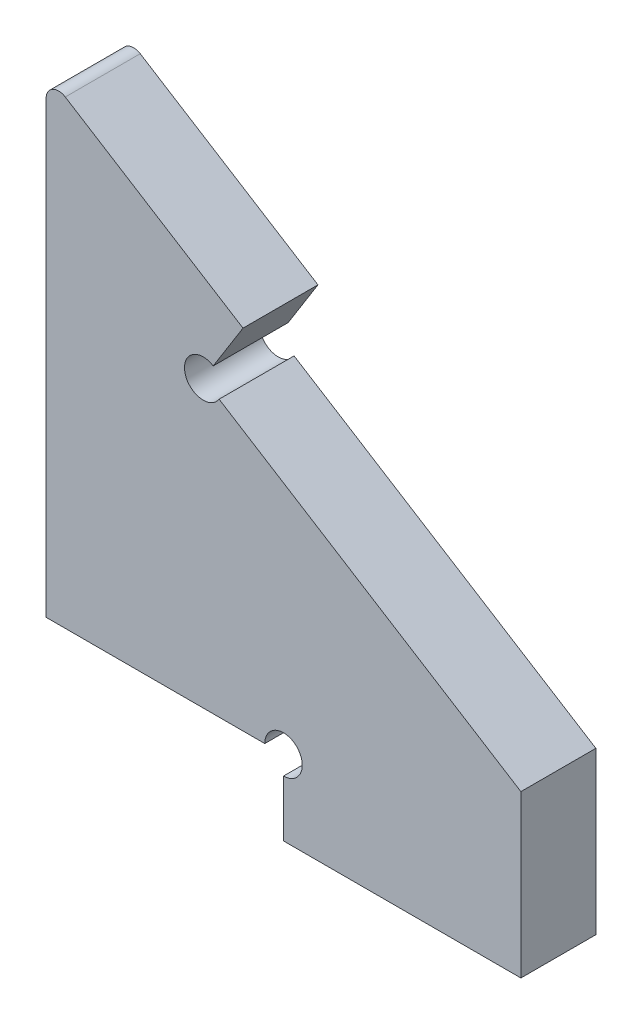
ISO-10303-21;
HEADER;
FILE_DESCRIPTION(('STEP AP214'),'2;1');
FILE_NAME('part.step','',(''),(''),'','','');
FILE_SCHEMA(('AUTOMOTIVE_DESIGN { 1 0 10303 214 1 1 1 1 }'));
ENDSEC;
DATA;
#1=APPLICATION_CONTEXT('core data for automotive mechanical design processes');
#2=APPLICATION_PROTOCOL_DEFINITION('international standard','automotive_design',2000,#1);
#3=PRODUCT_CONTEXT('',#1,'mechanical');
#4=PRODUCT('Part','Part','',(#3));
#5=PRODUCT_RELATED_PRODUCT_CATEGORY('part','',(#4));
#6=PRODUCT_DEFINITION_FORMATION('','',#4);
#7=PRODUCT_DEFINITION_CONTEXT('part definition',#1,'design');
#8=PRODUCT_DEFINITION('design','',#6,#7);
#9=PRODUCT_DEFINITION_SHAPE('','',#8);
#10=(LENGTH_UNIT() NAMED_UNIT(*) SI_UNIT(.MILLI.,.METRE.));
#11=(NAMED_UNIT(*) PLANE_ANGLE_UNIT() SI_UNIT($,.RADIAN.));
#12=(NAMED_UNIT(*) SI_UNIT($,.STERADIAN.) SOLID_ANGLE_UNIT());
#13=UNCERTAINTY_MEASURE_WITH_UNIT(LENGTH_MEASURE(1.E-05),#10,'distance_accuracy_value','');
#14=(GEOMETRIC_REPRESENTATION_CONTEXT(3) GLOBAL_UNCERTAINTY_ASSIGNED_CONTEXT((#13)) GLOBAL_UNIT_ASSIGNED_CONTEXT((#10,
#11,#12)) REPRESENTATION_CONTEXT('',''));
#15=CARTESIAN_POINT('',(0.,0.,0.));
#16=DIRECTION('',(0.,0.,1.));
#17=DIRECTION('',(1.,0.,0.));
#18=AXIS2_PLACEMENT_3D('',#15,#16,#17);
#19=CARTESIAN_POINT('',(724.,125.,-24.9999999999996));
#20=DIRECTION('',(0.,1.,0.));
#21=DIRECTION('',(0.,0.,1.));
#22=AXIS2_PLACEMENT_3D('',#19,#20,#21);
#23=PLANE('',#22);
#24=DIRECTION('',(1.,0.,0.));
#25=VECTOR('',#24,1.);
#26=CARTESIAN_POINT('',(724.,125.,-30.9999999999996));
#27=LINE('',#26,#25);
#28=CARTESIAN_POINT('',(705.,125.,-30.9999999999996));
#29=VERTEX_POINT('',#28);
#30=CARTESIAN_POINT('',(724.,125.,-30.9999999999996));
#31=VERTEX_POINT('',#30);
#32=EDGE_CURVE('E160',#29,#31,#27,.T.);
#33=ORIENTED_EDGE('',*,*,#32,.T.);
#34=DIRECTION('',(0.,0.,-1.));
#35=VECTOR('',#34,1.);
#36=CARTESIAN_POINT('',(724.,125.,-24.9999999999996));
#37=LINE('',#36,#35);
#38=CARTESIAN_POINT('',(724.,125.,-24.9999999999996));
#39=VERTEX_POINT('',#38);
#40=EDGE_CURVE('E204',#39,#31,#37,.T.);
#41=ORIENTED_EDGE('',*,*,#40,.F.);
#42=DIRECTION('',(1.,0.,0.));
#43=VECTOR('',#42,1.);
#44=CARTESIAN_POINT('',(724.,125.,-24.9999999999996));
#45=LINE('',#44,#43);
#46=CARTESIAN_POINT('',(705.,125.,-24.9999999999996));
#47=VERTEX_POINT('',#46);
#48=EDGE_CURVE('E181',#47,#39,#45,.T.);
#49=ORIENTED_EDGE('',*,*,#48,.F.);
#50=DIRECTION('',(0.,0.,-1.));
#51=VECTOR('',#50,1.);
#52=CARTESIAN_POINT('',(705.,125.,-24.9999999999996));
#53=LINE('',#52,#51);
#54=EDGE_CURVE('E191',#47,#29,#53,.T.);
#55=ORIENTED_EDGE('',*,*,#54,.T.);
#56=EDGE_LOOP('',(#33,#41,#49,#55));
#57=FACE_BOUND('',#56,.T.);
#58=ADVANCED_FACE('F36',(#57),#23,.F.);
#59=CARTESIAN_POINT('',(724.,131.,-24.9999999999996));
#60=DIRECTION('',(-1.,0.,0.));
#61=DIRECTION('',(0.,0.,1.));
#62=AXIS2_PLACEMENT_3D('',#59,#60,#61);
#63=PLANE('',#62);
#64=DIRECTION('',(0.,1.,0.));
#65=VECTOR('',#64,1.);
#66=CARTESIAN_POINT('',(724.,131.,-30.9999999999996));
#67=LINE('',#66,#65);
#68=CARTESIAN_POINT('',(724.,137.920851514906,-30.9999999999996));
#69=VERTEX_POINT('',#68);
#70=EDGE_CURVE('E195',#31,#69,#67,.T.);
#71=ORIENTED_EDGE('',*,*,#70,.T.);
#72=DIRECTION('',(0.,0.,1.));
#73=VECTOR('',#72,1.);
#74=CARTESIAN_POINT('',(724.,137.920851514906,-30.9999999999996));
#75=LINE('',#74,#73);
#76=CARTESIAN_POINT('',(724.,137.920851514906,-24.9999999999996));
#77=VERTEX_POINT('',#76);
#78=EDGE_CURVE('E134',#69,#77,#75,.T.);
#79=ORIENTED_EDGE('',*,*,#78,.T.);
#80=DIRECTION('',(0.,1.,0.));
#81=VECTOR('',#80,1.);
#82=CARTESIAN_POINT('',(724.,131.,-24.9999999999996));
#83=LINE('',#82,#81);
#84=EDGE_CURVE('E184',#39,#77,#83,.T.);
#85=ORIENTED_EDGE('',*,*,#84,.F.);
#86=ORIENTED_EDGE('',*,*,#40,.T.);
#87=EDGE_LOOP('',(#71,#79,#85,#86));
#88=FACE_BOUND('',#87,.T.);
#89=ADVANCED_FACE('F254',(#88),#63,.F.);
#90=CARTESIAN_POINT('',(705.,131.,-24.9999999999996));
#91=DIRECTION('',(1.,0.,0.));
#92=DIRECTION('',(0.,0.,-1.));
#93=AXIS2_PLACEMENT_3D('',#90,#91,#92);
#94=PLANE('',#93);
#95=DIRECTION('',(0.,-1.,0.));
#96=VECTOR('',#95,1.);
#97=CARTESIAN_POINT('',(705.,131.,-24.9999999999996));
#98=LINE('',#97,#96);
#99=CARTESIAN_POINT('',(705.,129.5,-24.9999999999996));
#100=VERTEX_POINT('',#99);
#101=EDGE_CURVE('E188',#100,#47,#98,.T.);
#102=ORIENTED_EDGE('',*,*,#101,.F.);
#103=DIRECTION('',(0.,0.,1.));
#104=VECTOR('',#103,1.);
#105=CARTESIAN_POINT('',(705.,129.5,-30.9999999999996));
#106=LINE('',#105,#104);
#107=CARTESIAN_POINT('',(705.,129.5,-30.9999999999996));
#108=VERTEX_POINT('',#107);
#109=EDGE_CURVE('E149',#100,#108,#106,.F.);
#110=ORIENTED_EDGE('',*,*,#109,.T.);
#111=DIRECTION('',(0.,-1.,0.));
#112=VECTOR('',#111,1.);
#113=CARTESIAN_POINT('',(705.,131.,-30.9999999999996));
#114=LINE('',#113,#112);
#115=EDGE_CURVE('E185',#108,#29,#114,.T.);
#116=ORIENTED_EDGE('',*,*,#115,.T.);
#117=ORIENTED_EDGE('',*,*,#54,.F.);
#118=EDGE_LOOP('',(#102,#110,#116,#117));
#119=FACE_BOUND('',#118,.T.);
#120=ADVANCED_FACE('F263',(#119),#94,.F.);
#121=CARTESIAN_POINT('',(0.,0.,-24.9999999999996));
#122=DIRECTION('',(0.,0.,1.));
#123=DIRECTION('',(1.,0.,0.));
#124=AXIS2_PLACEMENT_3D('',#121,#122,#123);
#125=PLANE('',#124);
#126=CARTESIAN_POINT('',(698.573213094909,153.841859890101,-24.9999999999996));
#127=DIRECTION('',(0.,0.,1.));
#128=DIRECTION('',(1.,0.,0.));
#129=AXIS2_PLACEMENT_3D('',#126,#127,#128);
#130=CIRCLE('',#129,1.49999999999996);
#131=CARTESIAN_POINT('',(699.369263513668,155.113199235356,-24.9999999999996));
#132=VERTEX_POINT('',#131);
#133=CARTESIAN_POINT('',(699.844552440163,153.045809471342,-24.9999999999996));
#134=VERTEX_POINT('',#133);
#135=EDGE_CURVE('E118',#132,#134,#130,.T.);
#136=ORIENTED_EDGE('',*,*,#135,.F.);
#137=DIRECTION('',(-0.530700279173186,-0.847559563503063,0.));
#138=VECTOR('',#137,1.);
#139=CARTESIAN_POINT('',(432.627023418039,-270.889848917371,-24.9999999999996));
#140=LINE('',#139,#138);
#141=CARTESIAN_POINT('',(701.757414769948,158.92721727112,-24.9999999999996));
#142=VERTEX_POINT('',#141);
#143=EDGE_CURVE('E125',#142,#132,#140,.T.);
#144=ORIENTED_EDGE('',*,*,#143,.F.);
#145=DIRECTION('',(-0.847559563503061,0.530700279173188,0.));
#146=VECTOR('',#145,1.);
#147=CARTESIAN_POINT('',(672.490911632306,177.252467854541,-24.9999999999996));
#148=LINE('',#147,#146);
#149=CARTESIAN_POINT('',(687.530700279174,167.835288959634,-24.9999999999996));
#150=VERTEX_POINT('',#149);
#151=EDGE_CURVE('E161',#142,#150,#148,.T.);
#152=ORIENTED_EDGE('',*,*,#151,.T.);
#153=CARTESIAN_POINT('',(687.,166.98772939613,-24.9999999999996));
#154=DIRECTION('',(0.,0.,1.));
#155=DIRECTION('',(1.,0.,0.));
#156=AXIS2_PLACEMENT_3D('',#153,#154,#155);
#157=CIRCLE('',#156,1.);
#158=CARTESIAN_POINT('',(686.,166.98772939613,-24.9999999999996));
#159=VERTEX_POINT('',#158);
#160=EDGE_CURVE('E45',#150,#159,#157,.T.);
#161=ORIENTED_EDGE('',*,*,#160,.T.);
#162=DIRECTION('',(0.,-1.,0.));
#163=VECTOR('',#162,1.);
#164=CARTESIAN_POINT('',(686.,198.827276630005,-24.9999999999996));
#165=LINE('',#164,#163);
#166=CARTESIAN_POINT('',(686.,131.,-24.9999999999996));
#167=VERTEX_POINT('',#166);
#168=EDGE_CURVE('E173',#159,#167,#165,.T.);
#169=ORIENTED_EDGE('',*,*,#168,.T.);
#170=DIRECTION('',(1.,0.,0.));
#171=VECTOR('',#170,1.);
#172=CARTESIAN_POINT('',(686.,131.,-24.9999999999996));
#173=LINE('',#172,#171);
#174=CARTESIAN_POINT('',(703.5,131.,-24.9999999999996));
#175=VERTEX_POINT('',#174);
#176=EDGE_CURVE('E169',#167,#175,#173,.T.);
#177=ORIENTED_EDGE('',*,*,#176,.T.);
#178=CARTESIAN_POINT('',(705.,131.,-24.9999999999996));
#179=DIRECTION('',(0.,0.,1.));
#180=DIRECTION('',(1.,0.,0.));
#181=AXIS2_PLACEMENT_3D('',#178,#179,#180);
#182=CIRCLE('',#181,1.49999999999996);
#183=EDGE_CURVE('E138',#100,#175,#182,.T.);
#184=ORIENTED_EDGE('',*,*,#183,.F.);
#185=ORIENTED_EDGE('',*,*,#101,.T.);
#186=ORIENTED_EDGE('',*,*,#48,.T.);
#187=ORIENTED_EDGE('',*,*,#84,.T.);
#188=DIRECTION('',(0.847559563503061,-0.530700279173189,0.));
#189=VECTOR('',#188,1.);
#190=CARTESIAN_POINT('',(265.946189676872,424.731708807473,-24.9999999999996));
#191=LINE('',#190,#189);
#192=EDGE_CURVE('E128',#134,#77,#191,.T.);
#193=ORIENTED_EDGE('',*,*,#192,.F.);
#194=EDGE_LOOP('',(#136,#144,#152,#161,#169,#177,#184,#185,#186,#187,#193));
#195=FACE_BOUND('',#194,.T.);
#196=ADVANCED_FACE('F124',(#195),#125,.T.);
#197=CARTESIAN_POINT('',(0.,0.,-30.9999999999996));
#198=DIRECTION('',(0.,0.,1.));
#199=DIRECTION('',(1.,0.,0.));
#200=AXIS2_PLACEMENT_3D('',#197,#198,#199);
#201=PLANE('',#200);
#202=DIRECTION('',(-0.530700279173186,-0.847559563503063,0.));
#203=VECTOR('',#202,1.);
#204=CARTESIAN_POINT('',(701.757414769948,158.92721727112,-30.9999999999996));
#205=LINE('',#204,#203);
#206=CARTESIAN_POINT('',(701.757414769947,158.92721727112,-30.9999999999996));
#207=VERTEX_POINT('',#206);
#208=CARTESIAN_POINT('',(699.369263513668,155.113199235356,-30.9999999999996));
#209=VERTEX_POINT('',#208);
#210=EDGE_CURVE('E58',#207,#209,#205,.T.);
#211=ORIENTED_EDGE('',*,*,#210,.T.);
#212=CARTESIAN_POINT('',(698.573213094909,153.841859890101,-30.9999999999996));
#213=DIRECTION('',(0.,0.,1.));
#214=DIRECTION('',(1.,0.,0.));
#215=AXIS2_PLACEMENT_3D('',#212,#213,#214);
#216=CIRCLE('',#215,1.49999999999996);
#217=CARTESIAN_POINT('',(699.844552440163,153.045809471342,-30.9999999999996));
#218=VERTEX_POINT('',#217);
#219=EDGE_CURVE('E52',#209,#218,#216,.T.);
#220=ORIENTED_EDGE('',*,*,#219,.T.);
#221=DIRECTION('',(0.847559563503061,-0.530700279173189,0.));
#222=VECTOR('',#221,1.);
#223=CARTESIAN_POINT('',(698.573213094909,153.841859890101,-30.9999999999996));
#224=LINE('',#223,#222);
#225=EDGE_CURVE('E239',#218,#69,#224,.T.);
#226=ORIENTED_EDGE('',*,*,#225,.T.);
#227=ORIENTED_EDGE('',*,*,#70,.F.);
#228=ORIENTED_EDGE('',*,*,#32,.F.);
#229=ORIENTED_EDGE('',*,*,#115,.F.);
#230=CARTESIAN_POINT('',(705.,131.,-30.9999999999996));
#231=DIRECTION('',(0.,0.,1.));
#232=DIRECTION('',(1.,0.,0.));
#233=AXIS2_PLACEMENT_3D('',#230,#231,#232);
#234=CIRCLE('',#233,1.49999999999996);
#235=CARTESIAN_POINT('',(703.5,131.,-30.9999999999996));
#236=VERTEX_POINT('',#235);
#237=EDGE_CURVE('E145',#108,#236,#234,.T.);
#238=ORIENTED_EDGE('',*,*,#237,.T.);
#239=DIRECTION('',(-1.,0.,0.));
#240=VECTOR('',#239,1.);
#241=CARTESIAN_POINT('',(686.,131.,-30.9999999999996));
#242=LINE('',#241,#240);
#243=CARTESIAN_POINT('',(686.,131.,-30.9999999999996));
#244=VERTEX_POINT('',#243);
#245=EDGE_CURVE('E155',#236,#244,#242,.T.);
#246=ORIENTED_EDGE('',*,*,#245,.T.);
#247=DIRECTION('',(0.,-1.,0.));
#248=VECTOR('',#247,1.);
#249=CARTESIAN_POINT('',(686.,198.827276630005,-30.9999999999996));
#250=LINE('',#249,#248);
#251=CARTESIAN_POINT('',(686.,166.98772939613,-30.9999999999996));
#252=VERTEX_POINT('',#251);
#253=EDGE_CURVE('E176',#252,#244,#250,.T.);
#254=ORIENTED_EDGE('',*,*,#253,.F.);
#255=CARTESIAN_POINT('',(687.,166.98772939613,-30.9999999999996));
#256=DIRECTION('',(0.,0.,1.));
#257=DIRECTION('',(1.,0.,0.));
#258=AXIS2_PLACEMENT_3D('',#255,#256,#257);
#259=CIRCLE('',#258,1.);
#260=CARTESIAN_POINT('',(687.530700279174,167.835288959634,-30.9999999999996));
#261=VERTEX_POINT('',#260);
#262=EDGE_CURVE('E216',#252,#261,#259,.F.);
#263=ORIENTED_EDGE('',*,*,#262,.T.);
#264=DIRECTION('',(0.847559563503061,-0.530700279173188,0.));
#265=VECTOR('',#264,1.);
#266=CARTESIAN_POINT('',(672.490911632306,177.252467854541,-30.9999999999996));
#267=LINE('',#266,#265);
#268=EDGE_CURVE('E156',#261,#207,#267,.T.);
#269=ORIENTED_EDGE('',*,*,#268,.T.);
#270=EDGE_LOOP('',(#211,#220,#226,#227,#228,#229,#238,#246,#254,#263,#269));
#271=FACE_BOUND('',#270,.T.);
#272=ADVANCED_FACE('F235',(#271),#201,.F.);
#273=CARTESIAN_POINT('',(0.,131.,0.));
#274=DIRECTION('',(0.,1.,0.));
#275=DIRECTION('',(0.,0.,1.));
#276=AXIS2_PLACEMENT_3D('',#273,#274,#275);
#277=PLANE('',#276);
#278=ORIENTED_EDGE('',*,*,#245,.F.);
#279=DIRECTION('',(0.,0.,1.));
#280=VECTOR('',#279,1.);
#281=CARTESIAN_POINT('',(703.5,131.,-30.9999999999996));
#282=LINE('',#281,#280);
#283=EDGE_CURVE('E208',#236,#175,#282,.T.);
#284=ORIENTED_EDGE('',*,*,#283,.T.);
#285=ORIENTED_EDGE('',*,*,#176,.F.);
#286=DIRECTION('',(0.,0.,1.));
#287=VECTOR('',#286,1.);
#288=CARTESIAN_POINT('',(686.,131.,-30.9999999999996));
#289=LINE('',#288,#287);
#290=EDGE_CURVE('E165',#244,#167,#289,.T.);
#291=ORIENTED_EDGE('',*,*,#290,.F.);
#292=EDGE_LOOP('',(#278,#284,#285,#291));
#293=FACE_BOUND('',#292,.T.);
#294=ADVANCED_FACE('F269',(#293),#277,.F.);
#295=CARTESIAN_POINT('',(686.,198.827276630005,-30.9999999999996));
#296=DIRECTION('',(1.,0.,0.));
#297=DIRECTION('',(0.,0.,-1.));
#298=AXIS2_PLACEMENT_3D('',#295,#296,#297);
#299=PLANE('',#298);
#300=ORIENTED_EDGE('',*,*,#168,.F.);
#301=DIRECTION('',(0.,0.,-1.));
#302=VECTOR('',#301,1.);
#303=CARTESIAN_POINT('',(686.,166.98772939613,-30.9999999999996));
#304=LINE('',#303,#302);
#305=EDGE_CURVE('E212',#159,#252,#304,.T.);
#306=ORIENTED_EDGE('',*,*,#305,.T.);
#307=ORIENTED_EDGE('',*,*,#253,.T.);
#308=ORIENTED_EDGE('',*,*,#290,.T.);
#309=EDGE_LOOP('',(#300,#306,#307,#308));
#310=FACE_BOUND('',#309,.T.);
#311=ADVANCED_FACE('F229',(#310),#299,.F.);
#312=CARTESIAN_POINT('',(203.909377291698,470.655270204094,323.5));
#313=DIRECTION('',(-0.530700279173188,-0.847559563503061,0.));
#314=DIRECTION('',(-0.847559563503061,0.530700279173188,0.));
#315=AXIS2_PLACEMENT_3D('',#312,#313,#314);
#316=PLANE('',#315);
#317=ORIENTED_EDGE('',*,*,#151,.F.);
#318=DIRECTION('',(0.,0.,1.));
#319=VECTOR('',#318,1.);
#320=CARTESIAN_POINT('',(701.757414769948,158.92721727112,-30.9999999999996));
#321=LINE('',#320,#319);
#322=EDGE_CURVE('E132',#207,#142,#321,.T.);
#323=ORIENTED_EDGE('',*,*,#322,.F.);
#324=ORIENTED_EDGE('',*,*,#268,.F.);
#325=DIRECTION('',(0.,0.,-1.));
#326=VECTOR('',#325,1.);
#327=CARTESIAN_POINT('',(687.530700279174,167.835288959634,323.5));
#328=LINE('',#327,#326);
#329=EDGE_CURVE('E219',#261,#150,#328,.F.);
#330=ORIENTED_EDGE('',*,*,#329,.T.);
#331=EDGE_LOOP('',(#317,#323,#324,#330));
#332=FACE_BOUND('',#331,.T.);
#333=ADVANCED_FACE('F237',(#332),#316,.F.);
#334=CARTESIAN_POINT('',(705.,131.,-30.9999999999996));
#335=DIRECTION('',(0.,0.,1.));
#336=DIRECTION('',(1.,0.,0.));
#337=AXIS2_PLACEMENT_3D('',#334,#335,#336);
#338=CYLINDRICAL_SURFACE('',#337,1.49999999999996);
#339=ORIENTED_EDGE('',*,*,#183,.T.);
#340=ORIENTED_EDGE('',*,*,#283,.F.);
#341=ORIENTED_EDGE('',*,*,#237,.F.);
#342=ORIENTED_EDGE('',*,*,#109,.F.);
#343=EDGE_LOOP('',(#339,#340,#341,#342));
#344=FACE_BOUND('',#343,.T.);
#345=ADVANCED_FACE('F266',(#344),#338,.F.);
#346=CARTESIAN_POINT('',(687.,166.98772939613,-30.9999999999996));
#347=DIRECTION('',(0.,0.,-1.));
#348=DIRECTION('',(0.,1.,0.));
#349=AXIS2_PLACEMENT_3D('',#346,#347,#348);
#350=CYLINDRICAL_SURFACE('',#349,1.);
#351=ORIENTED_EDGE('',*,*,#160,.F.);
#352=ORIENTED_EDGE('',*,*,#329,.F.);
#353=ORIENTED_EDGE('',*,*,#262,.F.);
#354=ORIENTED_EDGE('',*,*,#305,.F.);
#355=EDGE_LOOP('',(#351,#352,#353,#354));
#356=FACE_BOUND('',#355,.T.);
#357=ADVANCED_FACE('F38',(#356),#350,.T.);
#358=CARTESIAN_POINT('',(698.573213094909,153.841859890101,-30.9999999999996));
#359=DIRECTION('',(-0.530700279173189,-0.847559563503061,0.));
#360=DIRECTION('',(0.847559563503061,-0.530700279173189,0.));
#361=AXIS2_PLACEMENT_3D('',#358,#359,#360);
#362=PLANE('',#361);
#363=ORIENTED_EDGE('',*,*,#225,.F.);
#364=DIRECTION('',(0.,0.,1.));
#365=VECTOR('',#364,1.);
#366=CARTESIAN_POINT('',(699.844552440163,153.045809471342,-30.9999999999996));
#367=LINE('',#366,#365);
#368=EDGE_CURVE('E245',#218,#134,#367,.T.);
#369=ORIENTED_EDGE('',*,*,#368,.T.);
#370=ORIENTED_EDGE('',*,*,#192,.T.);
#371=ORIENTED_EDGE('',*,*,#78,.F.);
#372=EDGE_LOOP('',(#363,#369,#370,#371));
#373=FACE_BOUND('',#372,.T.);
#374=ADVANCED_FACE('F252',(#373),#362,.F.);
#375=CARTESIAN_POINT('',(701.757414769948,158.92721727112,-30.9999999999996));
#376=DIRECTION('',(-0.847559563503063,0.530700279173186,0.));
#377=DIRECTION('',(-0.530700279173186,-0.847559563503063,0.));
#378=AXIS2_PLACEMENT_3D('',#375,#376,#377);
#379=PLANE('',#378);
#380=ORIENTED_EDGE('',*,*,#143,.T.);
#381=DIRECTION('',(0.,0.,1.));
#382=VECTOR('',#381,1.);
#383=CARTESIAN_POINT('',(699.369263513668,155.113199235356,-30.9999999999996));
#384=LINE('',#383,#382);
#385=EDGE_CURVE('E11',#132,#209,#384,.F.);
#386=ORIENTED_EDGE('',*,*,#385,.T.);
#387=ORIENTED_EDGE('',*,*,#210,.F.);
#388=ORIENTED_EDGE('',*,*,#322,.T.);
#389=EDGE_LOOP('',(#380,#386,#387,#388));
#390=FACE_BOUND('',#389,.T.);
#391=ADVANCED_FACE('F131',(#390),#379,.F.);
#392=CARTESIAN_POINT('',(698.573213094909,153.841859890101,-30.9999999999996));
#393=DIRECTION('',(0.,0.,1.));
#394=DIRECTION('',(1.,0.,0.));
#395=AXIS2_PLACEMENT_3D('',#392,#393,#394);
#396=CYLINDRICAL_SURFACE('',#395,1.49999999999996);
#397=ORIENTED_EDGE('',*,*,#219,.F.);
#398=ORIENTED_EDGE('',*,*,#385,.F.);
#399=ORIENTED_EDGE('',*,*,#135,.T.);
#400=ORIENTED_EDGE('',*,*,#368,.F.);
#401=EDGE_LOOP('',(#397,#398,#399,#400));
#402=FACE_BOUND('',#401,.T.);
#403=ADVANCED_FACE('F117',(#402),#396,.F.);
#404=CLOSED_SHELL('',(#58,#89,#120,#196,#272,#294,#311,#333,#345,#357,#374,#391,#403));
#405=MANIFOLD_SOLID_BREP('B2',#404);
#406=ADVANCED_BREP_SHAPE_REPRESENTATION('',(#18,#405),#14);
#407=SHAPE_DEFINITION_REPRESENTATION(#9,#406);
ENDSEC;
END-ISO-10303-21;
